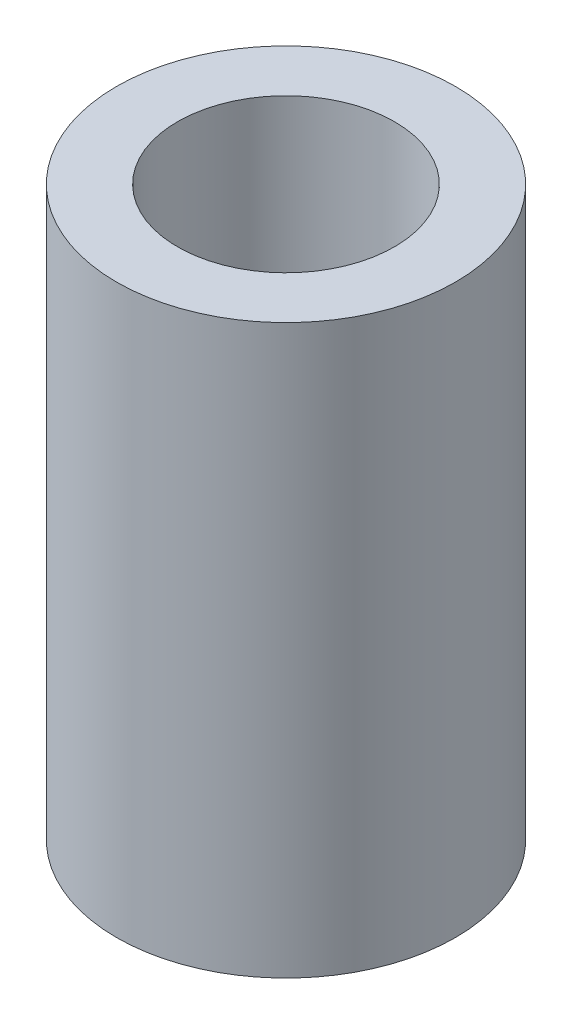
ISO-10303-21;
HEADER;
FILE_DESCRIPTION(('STEP AP214'),'2;1');
FILE_NAME('part.step','',(''),(''),'','','');
FILE_SCHEMA(('AUTOMOTIVE_DESIGN { 1 0 10303 214 1 1 1 1 }'));
ENDSEC;
DATA;
#1=APPLICATION_CONTEXT('core data for automotive mechanical design processes');
#2=APPLICATION_PROTOCOL_DEFINITION('international standard','automotive_design',2000,#1);
#3=PRODUCT_CONTEXT('',#1,'mechanical');
#4=PRODUCT('Part','Part','',(#3));
#5=PRODUCT_RELATED_PRODUCT_CATEGORY('part','',(#4));
#6=PRODUCT_DEFINITION_FORMATION('','',#4);
#7=PRODUCT_DEFINITION_CONTEXT('part definition',#1,'design');
#8=PRODUCT_DEFINITION('design','',#6,#7);
#9=PRODUCT_DEFINITION_SHAPE('','',#8);
#10=(LENGTH_UNIT() NAMED_UNIT(*) SI_UNIT(.MILLI.,.METRE.));
#11=(NAMED_UNIT(*) PLANE_ANGLE_UNIT() SI_UNIT($,.RADIAN.));
#12=(NAMED_UNIT(*) SI_UNIT($,.STERADIAN.) SOLID_ANGLE_UNIT());
#13=UNCERTAINTY_MEASURE_WITH_UNIT(LENGTH_MEASURE(1.E-05),#10,'distance_accuracy_value','');
#14=(GEOMETRIC_REPRESENTATION_CONTEXT(3) GLOBAL_UNCERTAINTY_ASSIGNED_CONTEXT((#13)) GLOBAL_UNIT_ASSIGNED_CONTEXT((#10,
#11,#12)) REPRESENTATION_CONTEXT('',''));
#15=CARTESIAN_POINT('',(0.,0.,0.));
#16=DIRECTION('',(0.,0.,1.));
#17=DIRECTION('',(1.,0.,0.));
#18=AXIS2_PLACEMENT_3D('',#15,#16,#17);
#19=CARTESIAN_POINT('',(0.,15.4454678118655,0.));
#20=DIRECTION('',(0.,-1.,0.));
#21=DIRECTION('',(0.,0.,-1.));
#22=AXIS2_PLACEMENT_3D('',#19,#20,#21);
#23=CYLINDRICAL_SURFACE('',#22,2.5);
#24=CARTESIAN_POINT('',(0.,0.,0.));
#25=DIRECTION('',(0.,1.,0.));
#26=DIRECTION('',(0.,0.,1.));
#27=AXIS2_PLACEMENT_3D('',#24,#25,#26);
#28=CIRCLE('',#27,2.5);
#29=CARTESIAN_POINT('',(0.,0.,-2.5));
#30=VERTEX_POINT('',#29);
#31=EDGE_CURVE('E46',#30,#30,#28,.T.);
#32=CARTESIAN_POINT('',(0.,8.3744,0.));
#33=DIRECTION('',(0.,1.,0.));
#34=DIRECTION('',(-1.,0.,0.));
#35=AXIS2_PLACEMENT_3D('',#32,#33,#34);
#36=CIRCLE('',#35,2.5);
#37=CARTESIAN_POINT('',(0.,8.37439999999999,-2.5));
#38=VERTEX_POINT('',#37);
#39=EDGE_CURVE('E10',#38,#38,#36,.T.);
#40=CARTESIAN_POINT('',(0.,0.,-2.5));
#41=CARTESIAN_POINT('',(0.,0.0872333333333334,-2.5));
#42=CARTESIAN_POINT('',(0.,0.174466666666667,-2.5));
#43=CARTESIAN_POINT('',(0.,0.348933333333333,-2.5));
#44=CARTESIAN_POINT('',(0.,0.436166666666667,-2.5));
#45=CARTESIAN_POINT('',(0.,0.610633333333334,-2.5));
#46=CARTESIAN_POINT('',(0.,0.697866666666667,-2.5));
#47=CARTESIAN_POINT('',(0.,0.872333333333333,-2.5));
#48=CARTESIAN_POINT('',(0.,0.959566666666666,-2.5));
#49=CARTESIAN_POINT('',(0.,1.13403333333333,-2.5));
#50=CARTESIAN_POINT('',(0.,1.22126666666667,-2.5));
#51=CARTESIAN_POINT('',(0.,1.39573333333333,-2.5));
#52=CARTESIAN_POINT('',(0.,1.48296666666667,-2.5));
#53=CARTESIAN_POINT('',(0.,1.65743333333333,-2.5));
#54=CARTESIAN_POINT('',(0.,1.74466666666667,-2.5));
#55=CARTESIAN_POINT('',(0.,1.91913333333333,-2.5));
#56=CARTESIAN_POINT('',(0.,2.00636666666667,-2.5));
#57=CARTESIAN_POINT('',(0.,2.18083333333333,-2.5));
#58=CARTESIAN_POINT('',(0.,2.26806666666667,-2.5));
#59=CARTESIAN_POINT('',(0.,2.44253333333333,-2.5));
#60=CARTESIAN_POINT('',(0.,2.52976666666666,-2.5));
#61=CARTESIAN_POINT('',(0.,2.70423333333333,-2.5));
#62=CARTESIAN_POINT('',(0.,2.79146666666666,-2.5));
#63=CARTESIAN_POINT('',(0.,2.96593333333333,-2.5));
#64=CARTESIAN_POINT('',(0.,3.05316666666666,-2.5));
#65=CARTESIAN_POINT('',(0.,3.22763333333333,-2.5));
#66=CARTESIAN_POINT('',(0.,3.31486666666666,-2.5));
#67=CARTESIAN_POINT('',(0.,3.48933333333333,-2.5));
#68=CARTESIAN_POINT('',(0.,3.57656666666666,-2.5));
#69=CARTESIAN_POINT('',(0.,3.75103333333333,-2.5));
#70=CARTESIAN_POINT('',(0.,3.83826666666666,-2.5));
#71=CARTESIAN_POINT('',(0.,4.01273333333333,-2.5));
#72=CARTESIAN_POINT('',(0.,4.09996666666667,-2.5));
#73=CARTESIAN_POINT('',(0.,4.27443333333333,-2.5));
#74=CARTESIAN_POINT('',(0.,4.36166666666667,-2.5));
#75=CARTESIAN_POINT('',(0.,4.53613333333333,-2.5));
#76=CARTESIAN_POINT('',(0.,4.62336666666666,-2.5));
#77=CARTESIAN_POINT('',(0.,4.79783333333333,-2.5));
#78=CARTESIAN_POINT('',(0.,4.88506666666666,-2.5));
#79=CARTESIAN_POINT('',(0.,5.05953333333333,-2.5));
#80=CARTESIAN_POINT('',(0.,5.14676666666666,-2.5));
#81=CARTESIAN_POINT('',(0.,5.32123333333333,-2.5));
#82=CARTESIAN_POINT('',(0.,5.40846666666666,-2.5));
#83=CARTESIAN_POINT('',(0.,5.58293333333333,-2.5));
#84=CARTESIAN_POINT('',(0.,5.67016666666666,-2.5));
#85=CARTESIAN_POINT('',(0.,5.84463333333333,-2.5));
#86=CARTESIAN_POINT('',(0.,5.93186666666666,-2.5));
#87=CARTESIAN_POINT('',(0.,6.10633333333333,-2.5));
#88=CARTESIAN_POINT('',(0.,6.19356666666666,-2.5));
#89=CARTESIAN_POINT('',(0.,6.36803333333333,-2.5));
#90=CARTESIAN_POINT('',(0.,6.45526666666666,-2.5));
#91=CARTESIAN_POINT('',(0.,6.62973333333333,-2.5));
#92=CARTESIAN_POINT('',(0.,6.71696666666666,-2.5));
#93=CARTESIAN_POINT('',(0.,6.89143333333333,-2.5));
#94=CARTESIAN_POINT('',(0.,6.97866666666666,-2.5));
#95=CARTESIAN_POINT('',(0.,7.15313333333333,-2.5));
#96=CARTESIAN_POINT('',(0.,7.24036666666666,-2.5));
#97=CARTESIAN_POINT('',(0.,7.41483333333333,-2.5));
#98=CARTESIAN_POINT('',(0.,7.50206666666666,-2.5));
#99=CARTESIAN_POINT('',(0.,7.67653333333333,-2.5));
#100=CARTESIAN_POINT('',(0.,7.76376666666666,-2.5));
#101=CARTESIAN_POINT('',(0.,7.93823333333333,-2.5));
#102=CARTESIAN_POINT('',(0.,8.02546666666666,-2.5));
#103=CARTESIAN_POINT('',(0.,8.19993333333333,-2.5));
#104=CARTESIAN_POINT('',(0.,8.28716666666666,-2.5));
#105=CARTESIAN_POINT('',(0.,8.37439999999999,-2.5));
#106=B_SPLINE_CURVE_WITH_KNOTS('',3,(#40,#41,#42,#43,#44,#45,#46,#47,#48,#49,#50,#51,#52,#53,
#54,#55,#56,#57,#58,#59,#60,#61,#62,#63,#64,#65,#66,#67,#68,#69,#70,#71,#72,#73,#74,#75,#76,#77,
#78,#79,#80,#81,#82,#83,#84,#85,#86,#87,#88,#89,#90,#91,#92,#93,#94,#95,#96,#97,#98,#99,#100,
#101,#102,#103,#104,#105),.UNSPECIFIED.,.F.,.F.,(4,2,2,2,2,2,2,2,2,2,2,2,2,2,2,2,2,2,2,2,2,2,2,
2,2,2,2,2,2,2,2,2,4),(0.,0.2617,0.5234,0.7851,1.0468,1.3085,1.5702,1.8319,2.0936,2.3553,2.617,
2.8787,3.1404,3.4021,3.6638,3.9255,4.1872,4.4489,4.7106,4.9723,5.234,5.4957,5.7574,6.0191,
6.2808,6.5425,6.8042,7.0659,7.3276,7.5893,7.85099999999999,8.11269999999999,8.37439999999999),.UNSPECIFIED.);
#107=EDGE_CURVE('BSEAM39',#30,#38,#106,.T.);
#108=ORIENTED_EDGE('',*,*,#31,.T.);
#109=ORIENTED_EDGE('',*,*,#39,.F.);
#110=ORIENTED_EDGE('',*,*,#107,.T.);
#111=ORIENTED_EDGE('',*,*,#107,.F.);
#112=EDGE_LOOP('',(#108,#110,#109,#111));
#113=FACE_BOUND('',#112,.T.);
#114=ADVANCED_FACE('F39',(#113),#23,.T.);
#115=CARTESIAN_POINT('',(0.,0.,0.));
#116=DIRECTION('',(0.,1.,0.));
#117=DIRECTION('',(0.,0.,1.));
#118=AXIS2_PLACEMENT_3D('',#115,#116,#117);
#119=PLANE('',#118);
#120=ORIENTED_EDGE('',*,*,#31,.F.);
#121=EDGE_LOOP('',(#120));
#122=FACE_BOUND('',#121,.T.);
#123=CARTESIAN_POINT('',(0.,0.,0.));
#124=DIRECTION('',(0.,1.,0.));
#125=DIRECTION('',(0.,0.,1.));
#126=AXIS2_PLACEMENT_3D('',#123,#124,#125);
#127=CIRCLE('',#126,1.6);
#128=CARTESIAN_POINT('',(0.,0.,-1.6));
#129=VERTEX_POINT('',#128);
#130=EDGE_CURVE('E51',#129,#129,#127,.T.);
#131=ORIENTED_EDGE('',*,*,#130,.T.);
#132=EDGE_LOOP('',(#131));
#133=FACE_BOUND('',#132,.T.);
#134=ADVANCED_FACE('F67',(#122,#133),#119,.F.);
#135=CARTESIAN_POINT('',(0.,15.4454678118655,0.));
#136=DIRECTION('',(0.,-1.,0.));
#137=DIRECTION('',(0.,0.,-1.));
#138=AXIS2_PLACEMENT_3D('',#135,#136,#137);
#139=CYLINDRICAL_SURFACE('',#138,1.6);
#140=CARTESIAN_POINT('',(0.,8.3744,0.));
#141=DIRECTION('',(0.,1.,0.));
#142=DIRECTION('',(-1.,0.,0.));
#143=AXIS2_PLACEMENT_3D('',#140,#141,#142);
#144=CIRCLE('',#143,1.6);
#145=CARTESIAN_POINT('',(0.,8.37439999999999,-1.6));
#146=VERTEX_POINT('',#145);
#147=EDGE_CURVE('E42',#146,#146,#144,.T.);
#148=CARTESIAN_POINT('',(0.,0.,-1.6));
#149=CARTESIAN_POINT('',(0.,0.0872333333333334,-1.6));
#150=CARTESIAN_POINT('',(0.,0.174466666666667,-1.6));
#151=CARTESIAN_POINT('',(0.,0.348933333333333,-1.6));
#152=CARTESIAN_POINT('',(0.,0.436166666666667,-1.6));
#153=CARTESIAN_POINT('',(0.,0.610633333333334,-1.6));
#154=CARTESIAN_POINT('',(0.,0.697866666666667,-1.6));
#155=CARTESIAN_POINT('',(0.,0.872333333333333,-1.6));
#156=CARTESIAN_POINT('',(0.,0.959566666666666,-1.6));
#157=CARTESIAN_POINT('',(0.,1.13403333333333,-1.6));
#158=CARTESIAN_POINT('',(0.,1.22126666666667,-1.6));
#159=CARTESIAN_POINT('',(0.,1.39573333333333,-1.6));
#160=CARTESIAN_POINT('',(0.,1.48296666666667,-1.6));
#161=CARTESIAN_POINT('',(0.,1.65743333333333,-1.6));
#162=CARTESIAN_POINT('',(0.,1.74466666666667,-1.6));
#163=CARTESIAN_POINT('',(0.,1.91913333333333,-1.6));
#164=CARTESIAN_POINT('',(0.,2.00636666666667,-1.6));
#165=CARTESIAN_POINT('',(0.,2.18083333333333,-1.6));
#166=CARTESIAN_POINT('',(0.,2.26806666666667,-1.6));
#167=CARTESIAN_POINT('',(0.,2.44253333333333,-1.6));
#168=CARTESIAN_POINT('',(0.,2.52976666666666,-1.6));
#169=CARTESIAN_POINT('',(0.,2.70423333333333,-1.6));
#170=CARTESIAN_POINT('',(0.,2.79146666666666,-1.6));
#171=CARTESIAN_POINT('',(0.,2.96593333333333,-1.6));
#172=CARTESIAN_POINT('',(0.,3.05316666666666,-1.6));
#173=CARTESIAN_POINT('',(0.,3.22763333333333,-1.6));
#174=CARTESIAN_POINT('',(0.,3.31486666666666,-1.6));
#175=CARTESIAN_POINT('',(0.,3.48933333333333,-1.6));
#176=CARTESIAN_POINT('',(0.,3.57656666666666,-1.6));
#177=CARTESIAN_POINT('',(0.,3.75103333333333,-1.6));
#178=CARTESIAN_POINT('',(0.,3.83826666666666,-1.6));
#179=CARTESIAN_POINT('',(0.,4.01273333333333,-1.6));
#180=CARTESIAN_POINT('',(0.,4.09996666666667,-1.6));
#181=CARTESIAN_POINT('',(0.,4.27443333333333,-1.6));
#182=CARTESIAN_POINT('',(0.,4.36166666666667,-1.6));
#183=CARTESIAN_POINT('',(0.,4.53613333333333,-1.6));
#184=CARTESIAN_POINT('',(0.,4.62336666666666,-1.6));
#185=CARTESIAN_POINT('',(0.,4.79783333333333,-1.6));
#186=CARTESIAN_POINT('',(0.,4.88506666666666,-1.6));
#187=CARTESIAN_POINT('',(0.,5.05953333333333,-1.6));
#188=CARTESIAN_POINT('',(0.,5.14676666666666,-1.6));
#189=CARTESIAN_POINT('',(0.,5.32123333333333,-1.6));
#190=CARTESIAN_POINT('',(0.,5.40846666666666,-1.6));
#191=CARTESIAN_POINT('',(0.,5.58293333333333,-1.6));
#192=CARTESIAN_POINT('',(0.,5.67016666666666,-1.6));
#193=CARTESIAN_POINT('',(0.,5.84463333333333,-1.6));
#194=CARTESIAN_POINT('',(0.,5.93186666666666,-1.6));
#195=CARTESIAN_POINT('',(0.,6.10633333333333,-1.6));
#196=CARTESIAN_POINT('',(0.,6.19356666666666,-1.6));
#197=CARTESIAN_POINT('',(0.,6.36803333333333,-1.6));
#198=CARTESIAN_POINT('',(0.,6.45526666666666,-1.6));
#199=CARTESIAN_POINT('',(0.,6.62973333333333,-1.6));
#200=CARTESIAN_POINT('',(0.,6.71696666666666,-1.6));
#201=CARTESIAN_POINT('',(0.,6.89143333333333,-1.6));
#202=CARTESIAN_POINT('',(0.,6.97866666666666,-1.6));
#203=CARTESIAN_POINT('',(0.,7.15313333333333,-1.6));
#204=CARTESIAN_POINT('',(0.,7.24036666666666,-1.6));
#205=CARTESIAN_POINT('',(0.,7.41483333333333,-1.6));
#206=CARTESIAN_POINT('',(0.,7.50206666666666,-1.6));
#207=CARTESIAN_POINT('',(0.,7.67653333333333,-1.6));
#208=CARTESIAN_POINT('',(0.,7.76376666666666,-1.6));
#209=CARTESIAN_POINT('',(0.,7.93823333333333,-1.6));
#210=CARTESIAN_POINT('',(0.,8.02546666666666,-1.6));
#211=CARTESIAN_POINT('',(0.,8.19993333333333,-1.6));
#212=CARTESIAN_POINT('',(0.,8.28716666666666,-1.6));
#213=CARTESIAN_POINT('',(0.,8.37439999999999,-1.6));
#214=B_SPLINE_CURVE_WITH_KNOTS('',3,(#148,#149,#150,#151,#152,#153,#154,#155,#156,#157,#158,
#159,#160,#161,#162,#163,#164,#165,#166,#167,#168,#169,#170,#171,#172,#173,#174,#175,#176,#177,
#178,#179,#180,#181,#182,#183,#184,#185,#186,#187,#188,#189,#190,#191,#192,#193,#194,#195,#196,
#197,#198,#199,#200,#201,#202,#203,#204,#205,#206,#207,#208,#209,#210,#211,#212,#213),
.UNSPECIFIED.,.F.,.F.,(4,2,2,2,2,2,2,2,2,2,2,2,2,2,2,2,2,2,2,2,2,2,2,2,2,2,2,2,2,2,2,2,4),(0.,
0.2617,0.5234,0.7851,1.0468,1.3085,1.5702,1.8319,2.0936,2.3553,2.617,2.8787,3.1404,3.4021,
3.6638,3.9255,4.1872,4.4489,4.7106,4.9723,5.234,5.4957,5.7574,6.0191,6.2808,6.5425,6.8042,
7.0659,7.3276,7.5893,7.85099999999999,8.11269999999999,8.37439999999999),.UNSPECIFIED.);
#215=EDGE_CURVE('BSEAM59',#129,#146,#214,.T.);
#216=ORIENTED_EDGE('',*,*,#130,.F.);
#217=ORIENTED_EDGE('',*,*,#147,.T.);
#218=ORIENTED_EDGE('',*,*,#215,.T.);
#219=ORIENTED_EDGE('',*,*,#215,.F.);
#220=EDGE_LOOP('',(#216,#218,#217,#219));
#221=FACE_BOUND('',#220,.T.);
#222=ADVANCED_FACE('F59',(#221),#139,.F.);
#223=CARTESIAN_POINT('',(7.41821386184428,8.3744,32.2240705198272));
#224=DIRECTION('',(0.,1.,0.));
#225=DIRECTION('',(0.,0.,1.));
#226=AXIS2_PLACEMENT_3D('',#223,#224,#225);
#227=PLANE('',#226);
#228=ORIENTED_EDGE('',*,*,#147,.F.);
#229=EDGE_LOOP('',(#228));
#230=FACE_BOUND('',#229,.T.);
#231=ORIENTED_EDGE('',*,*,#39,.T.);
#232=EDGE_LOOP('',(#231));
#233=FACE_BOUND('',#232,.T.);
#234=ADVANCED_FACE('F61',(#230,#233),#227,.T.);
#235=CLOSED_SHELL('',(#114,#134,#222,#234));
#236=MANIFOLD_SOLID_BREP('B2',#235);
#237=ADVANCED_BREP_SHAPE_REPRESENTATION('',(#18,#236),#14);
#238=SHAPE_DEFINITION_REPRESENTATION(#9,#237);
ENDSEC;
END-ISO-10303-21;
